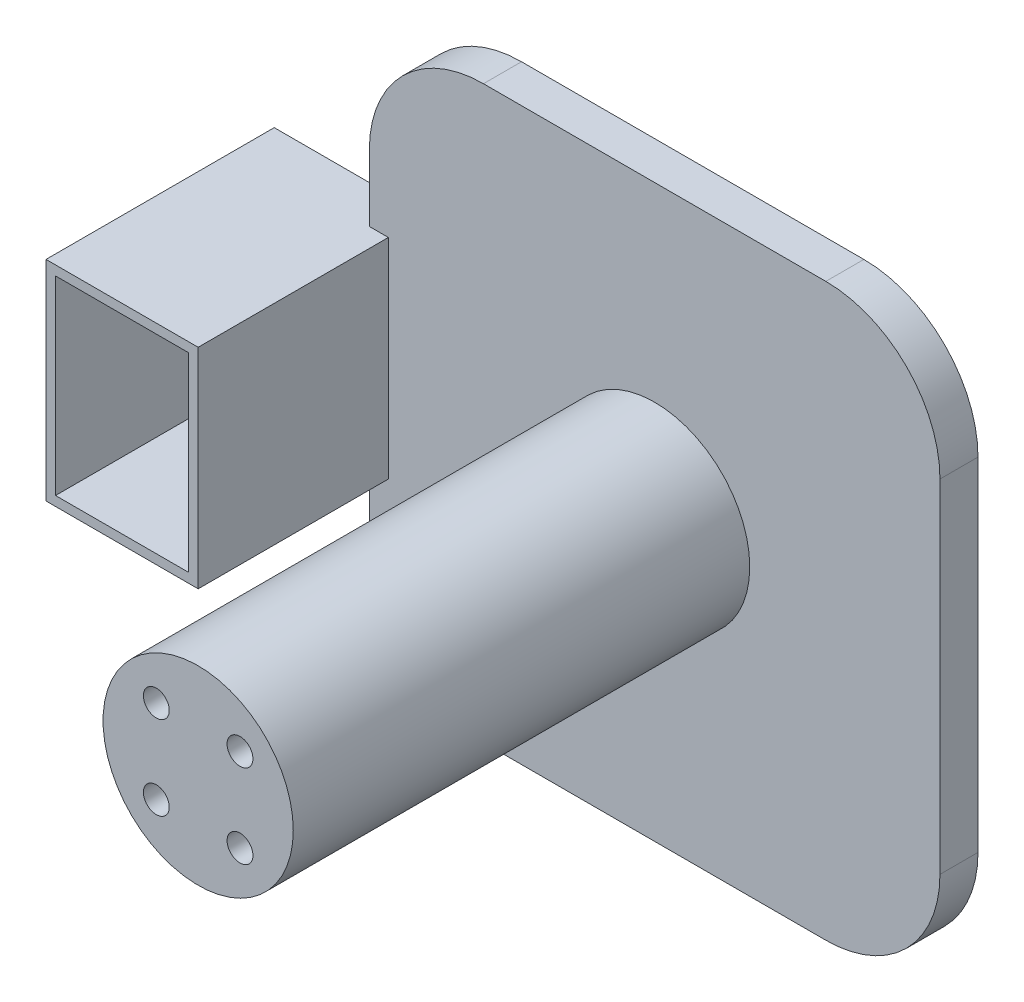
ISO-10303-21;
HEADER;
FILE_DESCRIPTION(('STEP AP214'),'2;1');
FILE_NAME('part.step','',(''),(''),'','','');
FILE_SCHEMA(('AUTOMOTIVE_DESIGN { 1 0 10303 214 1 1 1 1 }'));
ENDSEC;
DATA;
#1=APPLICATION_CONTEXT('core data for automotive mechanical design processes');
#2=APPLICATION_PROTOCOL_DEFINITION('international standard','automotive_design',2000,#1);
#3=PRODUCT_CONTEXT('',#1,'mechanical');
#4=PRODUCT('Part','Part','',(#3));
#5=PRODUCT_RELATED_PRODUCT_CATEGORY('part','',(#4));
#6=PRODUCT_DEFINITION_FORMATION('','',#4);
#7=PRODUCT_DEFINITION_CONTEXT('part definition',#1,'design');
#8=PRODUCT_DEFINITION('design','',#6,#7);
#9=PRODUCT_DEFINITION_SHAPE('','',#8);
#10=(LENGTH_UNIT() NAMED_UNIT(*) SI_UNIT(.MILLI.,.METRE.));
#11=(NAMED_UNIT(*) PLANE_ANGLE_UNIT() SI_UNIT($,.RADIAN.));
#12=(NAMED_UNIT(*) SI_UNIT($,.STERADIAN.) SOLID_ANGLE_UNIT());
#13=UNCERTAINTY_MEASURE_WITH_UNIT(LENGTH_MEASURE(1.E-05),#10,'distance_accuracy_value','');
#14=(GEOMETRIC_REPRESENTATION_CONTEXT(3) GLOBAL_UNCERTAINTY_ASSIGNED_CONTEXT((#13)) GLOBAL_UNIT_ASSIGNED_CONTEXT((#10,
#11,#12)) REPRESENTATION_CONTEXT('',''));
#15=CARTESIAN_POINT('',(0.,0.,0.));
#16=DIRECTION('',(0.,0.,1.));
#17=DIRECTION('',(1.,0.,0.));
#18=AXIS2_PLACEMENT_3D('',#15,#16,#17);
#19=CARTESIAN_POINT('',(120.,120.,10.));
#20=DIRECTION('',(0.,0.,1.));
#21=DIRECTION('',(1.,0.,0.));
#22=AXIS2_PLACEMENT_3D('',#19,#20,#21);
#23=PLANE('',#22);
#24=CARTESIAN_POINT('',(75.,75.,10.));
#25=DIRECTION('',(0.,0.,1.));
#26=DIRECTION('',(1.,0.,0.));
#27=AXIS2_PLACEMENT_3D('',#24,#25,#26);
#28=CIRCLE('',#27,25.);
#29=CARTESIAN_POINT('',(100.,75.,10.));
#30=VERTEX_POINT('',#29);
#31=EDGE_CURVE('E11',#30,#30,#28,.T.);
#32=ORIENTED_EDGE('',*,*,#31,.F.);
#33=EDGE_LOOP('',(#32));
#34=FACE_BOUND('',#33,.T.);
#35=DIRECTION('',(0.,1.,0.));
#36=VECTOR('',#35,1.);
#37=CARTESIAN_POINT('',(5.,102.5,10.));
#38=LINE('',#37,#36);
#39=CARTESIAN_POINT('',(5.00000000000001,47.5,10.));
#40=VERTEX_POINT('',#39);
#41=CARTESIAN_POINT('',(5.,102.5,10.));
#42=VERTEX_POINT('',#41);
#43=EDGE_CURVE('E62',#40,#42,#38,.T.);
#44=ORIENTED_EDGE('',*,*,#43,.F.);
#45=DIRECTION('',(1.,0.,0.));
#46=VECTOR('',#45,1.);
#47=CARTESIAN_POINT('',(5.00000000000001,47.5,10.));
#48=LINE('',#47,#46);
#49=CARTESIAN_POINT('',(0.,47.5,10.));
#50=VERTEX_POINT('',#49);
#51=EDGE_CURVE('E194',#50,#40,#48,.T.);
#52=ORIENTED_EDGE('',*,*,#51,.F.);
#53=DIRECTION('',(0.,-1.,0.));
#54=VECTOR('',#53,1.);
#55=CARTESIAN_POINT('',(0.,30.0000000000002,10.));
#56=LINE('',#55,#54);
#57=CARTESIAN_POINT('',(0.,30.0000000000002,10.));
#58=VERTEX_POINT('',#57);
#59=EDGE_CURVE('E327',#50,#58,#56,.T.);
#60=ORIENTED_EDGE('',*,*,#59,.T.);
#61=CARTESIAN_POINT('',(30.,30.,10.));
#62=DIRECTION('',(0.,0.,1.));
#63=DIRECTION('',(1.,0.,0.));
#64=AXIS2_PLACEMENT_3D('',#61,#62,#63);
#65=CIRCLE('',#64,30.);
#66=CARTESIAN_POINT('',(30.0000000000002,0.,10.));
#67=VERTEX_POINT('',#66);
#68=EDGE_CURVE('E331',#58,#67,#65,.T.);
#69=ORIENTED_EDGE('',*,*,#68,.T.);
#70=DIRECTION('',(1.,0.,0.));
#71=VECTOR('',#70,1.);
#72=CARTESIAN_POINT('',(30.0000000000002,0.,10.));
#73=LINE('',#72,#71);
#74=CARTESIAN_POINT('',(120.,0.,10.));
#75=VERTEX_POINT('',#74);
#76=EDGE_CURVE('E334',#67,#75,#73,.T.);
#77=ORIENTED_EDGE('',*,*,#76,.T.);
#78=CARTESIAN_POINT('',(120.,30.,10.));
#79=DIRECTION('',(0.,0.,1.));
#80=DIRECTION('',(1.,0.,0.));
#81=AXIS2_PLACEMENT_3D('',#78,#79,#80);
#82=CIRCLE('',#81,30.);
#83=CARTESIAN_POINT('',(150.,30.,10.));
#84=VERTEX_POINT('',#83);
#85=EDGE_CURVE('E337',#75,#84,#82,.T.);
#86=ORIENTED_EDGE('',*,*,#85,.T.);
#87=DIRECTION('',(0.,1.,0.));
#88=VECTOR('',#87,1.);
#89=CARTESIAN_POINT('',(150.,30.,10.));
#90=LINE('',#89,#88);
#91=CARTESIAN_POINT('',(150.,120.,10.));
#92=VERTEX_POINT('',#91);
#93=EDGE_CURVE('E340',#84,#92,#90,.T.);
#94=ORIENTED_EDGE('',*,*,#93,.T.);
#95=CARTESIAN_POINT('',(120.,120.,10.));
#96=DIRECTION('',(0.,0.,1.));
#97=DIRECTION('',(1.,0.,0.));
#98=AXIS2_PLACEMENT_3D('',#95,#96,#97);
#99=CIRCLE('',#98,30.);
#100=CARTESIAN_POINT('',(120.,150.,10.));
#101=VERTEX_POINT('',#100);
#102=EDGE_CURVE('E316',#92,#101,#99,.T.);
#103=ORIENTED_EDGE('',*,*,#102,.T.);
#104=DIRECTION('',(-1.,0.,0.));
#105=VECTOR('',#104,1.);
#106=CARTESIAN_POINT('',(30.,150.,10.));
#107=LINE('',#106,#105);
#108=CARTESIAN_POINT('',(30.,150.,10.));
#109=VERTEX_POINT('',#108);
#110=EDGE_CURVE('E320',#101,#109,#107,.T.);
#111=ORIENTED_EDGE('',*,*,#110,.T.);
#112=CARTESIAN_POINT('',(30.,120.,10.));
#113=DIRECTION('',(0.,0.,1.));
#114=DIRECTION('',(-1.,0.,0.));
#115=AXIS2_PLACEMENT_3D('',#112,#113,#114);
#116=CIRCLE('',#115,30.);
#117=CARTESIAN_POINT('',(0.,120.,10.));
#118=VERTEX_POINT('',#117);
#119=EDGE_CURVE('E324',#109,#118,#116,.T.);
#120=ORIENTED_EDGE('',*,*,#119,.T.);
#121=CARTESIAN_POINT('',(0.,102.5,10.));
#122=VERTEX_POINT('',#121);
#123=EDGE_CURVE('E328',#118,#122,#56,.T.);
#124=ORIENTED_EDGE('',*,*,#123,.T.);
#125=DIRECTION('',(-1.,0.,0.));
#126=VECTOR('',#125,1.);
#127=CARTESIAN_POINT('',(-35.,102.5,10.));
#128=LINE('',#127,#126);
#129=EDGE_CURVE('E67',#42,#122,#128,.T.);
#130=ORIENTED_EDGE('',*,*,#129,.F.);
#131=EDGE_LOOP('',(#44,#52,#60,#69,#77,#86,#94,#103,#111,#120,#124,#130));
#132=FACE_BOUND('',#131,.T.);
#133=ADVANCED_FACE('F45',(#34,#132),#23,.T.);
#134=CARTESIAN_POINT('',(0.,30.0000000000002,10.));
#135=DIRECTION('',(1.,0.,0.));
#136=DIRECTION('',(0.,0.,-1.));
#137=AXIS2_PLACEMENT_3D('',#134,#135,#136);
#138=PLANE('',#137);
#139=DIRECTION('',(0.,0.,1.));
#140=VECTOR('',#139,1.);
#141=CARTESIAN_POINT('',(0.,102.5,0.));
#142=LINE('',#141,#140);
#143=CARTESIAN_POINT('',(0.,102.5,0.));
#144=VERTEX_POINT('',#143);
#145=EDGE_CURVE('E272',#144,#122,#142,.T.);
#146=ORIENTED_EDGE('',*,*,#145,.T.);
#147=ORIENTED_EDGE('',*,*,#123,.F.);
#148=DIRECTION('',(0.,0.,-1.));
#149=VECTOR('',#148,1.);
#150=CARTESIAN_POINT('',(0.,120.,10.));
#151=LINE('',#150,#149);
#152=CARTESIAN_POINT('',(0.,120.,0.));
#153=VERTEX_POINT('',#152);
#154=EDGE_CURVE('E387',#118,#153,#151,.T.);
#155=ORIENTED_EDGE('',*,*,#154,.T.);
#156=DIRECTION('',(0.,-1.,0.));
#157=VECTOR('',#156,1.);
#158=CARTESIAN_POINT('',(0.,30.0000000000002,0.));
#159=LINE('',#158,#157);
#160=EDGE_CURVE('E354',#153,#144,#159,.T.);
#161=ORIENTED_EDGE('',*,*,#160,.T.);
#162=EDGE_LOOP('',(#146,#147,#155,#161));
#163=FACE_BOUND('',#162,.T.);
#164=ADVANCED_FACE('F415',(#163),#138,.F.);
#165=CARTESIAN_POINT('',(120.,120.,10.));
#166=DIRECTION('',(0.,0.,-1.));
#167=DIRECTION('',(-1.,0.,0.));
#168=AXIS2_PLACEMENT_3D('',#165,#166,#167);
#169=CYLINDRICAL_SURFACE('',#168,30.);
#170=CARTESIAN_POINT('',(120.,120.,0.));
#171=DIRECTION('',(0.,0.,1.));
#172=DIRECTION('',(1.,0.,0.));
#173=AXIS2_PLACEMENT_3D('',#170,#171,#172);
#174=CIRCLE('',#173,30.);
#175=CARTESIAN_POINT('',(150.,120.,0.));
#176=VERTEX_POINT('',#175);
#177=CARTESIAN_POINT('',(120.,150.,0.));
#178=VERTEX_POINT('',#177);
#179=EDGE_CURVE('E314',#176,#178,#174,.T.);
#180=ORIENTED_EDGE('',*,*,#179,.T.);
#181=DIRECTION('',(0.,0.,-1.));
#182=VECTOR('',#181,1.);
#183=CARTESIAN_POINT('',(120.,150.,10.));
#184=LINE('',#183,#182);
#185=EDGE_CURVE('E49',#101,#178,#184,.T.);
#186=ORIENTED_EDGE('',*,*,#185,.F.);
#187=ORIENTED_EDGE('',*,*,#102,.F.);
#188=DIRECTION('',(0.,0.,-1.));
#189=VECTOR('',#188,1.);
#190=CARTESIAN_POINT('',(150.,120.,10.));
#191=LINE('',#190,#189);
#192=EDGE_CURVE('E343',#92,#176,#191,.T.);
#193=ORIENTED_EDGE('',*,*,#192,.T.);
#194=EDGE_LOOP('',(#180,#186,#187,#193));
#195=FACE_BOUND('',#194,.T.);
#196=ADVANCED_FACE('F47',(#195),#169,.T.);
#197=CARTESIAN_POINT('',(30.,150.,10.));
#198=DIRECTION('',(0.,-1.,0.));
#199=DIRECTION('',(0.,0.,-1.));
#200=AXIS2_PLACEMENT_3D('',#197,#198,#199);
#201=PLANE('',#200);
#202=DIRECTION('',(-1.,0.,0.));
#203=VECTOR('',#202,1.);
#204=CARTESIAN_POINT('',(30.,150.,0.));
#205=LINE('',#204,#203);
#206=CARTESIAN_POINT('',(30.,150.,0.));
#207=VERTEX_POINT('',#206);
#208=EDGE_CURVE('E347',#178,#207,#205,.T.);
#209=ORIENTED_EDGE('',*,*,#208,.T.);
#210=DIRECTION('',(0.,0.,-1.));
#211=VECTOR('',#210,1.);
#212=CARTESIAN_POINT('',(30.,150.,10.));
#213=LINE('',#212,#211);
#214=EDGE_CURVE('E390',#109,#207,#213,.T.);
#215=ORIENTED_EDGE('',*,*,#214,.F.);
#216=ORIENTED_EDGE('',*,*,#110,.F.);
#217=ORIENTED_EDGE('',*,*,#185,.T.);
#218=EDGE_LOOP('',(#209,#215,#216,#217));
#219=FACE_BOUND('',#218,.T.);
#220=ADVANCED_FACE('F401',(#219),#201,.F.);
#221=CARTESIAN_POINT('',(30.,120.,10.));
#222=DIRECTION('',(0.,0.,-1.));
#223=DIRECTION('',(-1.,0.,0.));
#224=AXIS2_PLACEMENT_3D('',#221,#222,#223);
#225=CYLINDRICAL_SURFACE('',#224,30.);
#226=CARTESIAN_POINT('',(30.,120.,0.));
#227=DIRECTION('',(0.,0.,1.));
#228=DIRECTION('',(-1.,0.,0.));
#229=AXIS2_PLACEMENT_3D('',#226,#227,#228);
#230=CIRCLE('',#229,30.);
#231=EDGE_CURVE('E350',#207,#153,#230,.T.);
#232=ORIENTED_EDGE('',*,*,#231,.T.);
#233=ORIENTED_EDGE('',*,*,#154,.F.);
#234=ORIENTED_EDGE('',*,*,#119,.F.);
#235=ORIENTED_EDGE('',*,*,#214,.T.);
#236=EDGE_LOOP('',(#232,#233,#234,#235));
#237=FACE_BOUND('',#236,.T.);
#238=ADVANCED_FACE('F412',(#237),#225,.T.);
#239=ORIENTED_EDGE('',*,*,#59,.F.);
#240=DIRECTION('',(0.,0.,1.));
#241=VECTOR('',#240,1.);
#242=CARTESIAN_POINT('',(0.,47.5,0.));
#243=LINE('',#242,#241);
#244=CARTESIAN_POINT('',(0.,47.5,0.));
#245=VERTEX_POINT('',#244);
#246=EDGE_CURVE('E275',#245,#50,#243,.T.);
#247=ORIENTED_EDGE('',*,*,#246,.F.);
#248=CARTESIAN_POINT('',(0.,30.0000000000002,0.));
#249=VERTEX_POINT('',#248);
#250=EDGE_CURVE('E353',#245,#249,#159,.T.);
#251=ORIENTED_EDGE('',*,*,#250,.T.);
#252=DIRECTION('',(0.,0.,-1.));
#253=VECTOR('',#252,1.);
#254=CARTESIAN_POINT('',(0.,30.0000000000002,10.));
#255=LINE('',#254,#253);
#256=EDGE_CURVE('E383',#58,#249,#255,.T.);
#257=ORIENTED_EDGE('',*,*,#256,.F.);
#258=EDGE_LOOP('',(#239,#247,#251,#257));
#259=FACE_BOUND('',#258,.T.);
#260=ADVANCED_FACE('F436',(#259),#138,.F.);
#261=CARTESIAN_POINT('',(30.,30.,10.));
#262=DIRECTION('',(0.,0.,-1.));
#263=DIRECTION('',(-1.,0.,0.));
#264=AXIS2_PLACEMENT_3D('',#261,#262,#263);
#265=CYLINDRICAL_SURFACE('',#264,30.);
#266=CARTESIAN_POINT('',(30.,30.,0.));
#267=DIRECTION('',(0.,0.,1.));
#268=DIRECTION('',(1.,0.,0.));
#269=AXIS2_PLACEMENT_3D('',#266,#267,#268);
#270=CIRCLE('',#269,30.);
#271=CARTESIAN_POINT('',(30.0000000000002,0.,0.));
#272=VERTEX_POINT('',#271);
#273=EDGE_CURVE('E357',#249,#272,#270,.T.);
#274=ORIENTED_EDGE('',*,*,#273,.T.);
#275=DIRECTION('',(0.,0.,-1.));
#276=VECTOR('',#275,1.);
#277=CARTESIAN_POINT('',(30.0000000000002,0.,10.));
#278=LINE('',#277,#276);
#279=EDGE_CURVE('E379',#67,#272,#278,.T.);
#280=ORIENTED_EDGE('',*,*,#279,.F.);
#281=ORIENTED_EDGE('',*,*,#68,.F.);
#282=ORIENTED_EDGE('',*,*,#256,.T.);
#283=EDGE_LOOP('',(#274,#280,#281,#282));
#284=FACE_BOUND('',#283,.T.);
#285=ADVANCED_FACE('F439',(#284),#265,.T.);
#286=CARTESIAN_POINT('',(30.0000000000002,0.,10.));
#287=DIRECTION('',(0.,1.,0.));
#288=DIRECTION('',(0.,0.,1.));
#289=AXIS2_PLACEMENT_3D('',#286,#287,#288);
#290=PLANE('',#289);
#291=DIRECTION('',(1.,0.,0.));
#292=VECTOR('',#291,1.);
#293=CARTESIAN_POINT('',(30.0000000000002,0.,0.));
#294=LINE('',#293,#292);
#295=CARTESIAN_POINT('',(120.,0.,0.));
#296=VERTEX_POINT('',#295);
#297=EDGE_CURVE('E360',#272,#296,#294,.T.);
#298=ORIENTED_EDGE('',*,*,#297,.T.);
#299=DIRECTION('',(0.,0.,-1.));
#300=VECTOR('',#299,1.);
#301=CARTESIAN_POINT('',(120.,0.,10.));
#302=LINE('',#301,#300);
#303=EDGE_CURVE('E375',#75,#296,#302,.T.);
#304=ORIENTED_EDGE('',*,*,#303,.F.);
#305=ORIENTED_EDGE('',*,*,#76,.F.);
#306=ORIENTED_EDGE('',*,*,#279,.T.);
#307=EDGE_LOOP('',(#298,#304,#305,#306));
#308=FACE_BOUND('',#307,.T.);
#309=ADVANCED_FACE('F444',(#308),#290,.F.);
#310=CARTESIAN_POINT('',(120.,30.,10.));
#311=DIRECTION('',(0.,0.,-1.));
#312=DIRECTION('',(-1.,0.,0.));
#313=AXIS2_PLACEMENT_3D('',#310,#311,#312);
#314=CYLINDRICAL_SURFACE('',#313,30.);
#315=CARTESIAN_POINT('',(120.,30.,0.));
#316=DIRECTION('',(0.,0.,1.));
#317=DIRECTION('',(1.,0.,0.));
#318=AXIS2_PLACEMENT_3D('',#315,#316,#317);
#319=CIRCLE('',#318,30.);
#320=CARTESIAN_POINT('',(150.,30.,0.));
#321=VERTEX_POINT('',#320);
#322=EDGE_CURVE('E363',#296,#321,#319,.T.);
#323=ORIENTED_EDGE('',*,*,#322,.T.);
#324=DIRECTION('',(0.,0.,-1.));
#325=VECTOR('',#324,1.);
#326=CARTESIAN_POINT('',(150.,30.,10.));
#327=LINE('',#326,#325);
#328=EDGE_CURVE('E371',#84,#321,#327,.T.);
#329=ORIENTED_EDGE('',*,*,#328,.F.);
#330=ORIENTED_EDGE('',*,*,#85,.F.);
#331=ORIENTED_EDGE('',*,*,#303,.T.);
#332=EDGE_LOOP('',(#323,#329,#330,#331));
#333=FACE_BOUND('',#332,.T.);
#334=ADVANCED_FACE('F449',(#333),#314,.T.);
#335=CARTESIAN_POINT('',(150.,30.,10.));
#336=DIRECTION('',(-1.,0.,0.));
#337=DIRECTION('',(0.,0.,1.));
#338=AXIS2_PLACEMENT_3D('',#335,#336,#337);
#339=PLANE('',#338);
#340=DIRECTION('',(0.,1.,0.));
#341=VECTOR('',#340,1.);
#342=CARTESIAN_POINT('',(150.,30.,0.));
#343=LINE('',#342,#341);
#344=EDGE_CURVE('E321',#321,#176,#343,.T.);
#345=ORIENTED_EDGE('',*,*,#344,.T.);
#346=ORIENTED_EDGE('',*,*,#192,.F.);
#347=ORIENTED_EDGE('',*,*,#93,.F.);
#348=ORIENTED_EDGE('',*,*,#328,.T.);
#349=EDGE_LOOP('',(#345,#346,#347,#348));
#350=FACE_BOUND('',#349,.T.);
#351=ADVANCED_FACE('F451',(#350),#339,.F.);
#352=CARTESIAN_POINT('',(120.,120.,0.));
#353=DIRECTION('',(0.,0.,1.));
#354=DIRECTION('',(1.,0.,0.));
#355=AXIS2_PLACEMENT_3D('',#352,#353,#354);
#356=PLANE('',#355);
#357=ORIENTED_EDGE('',*,*,#179,.F.);
#358=ORIENTED_EDGE('',*,*,#344,.F.);
#359=ORIENTED_EDGE('',*,*,#322,.F.);
#360=ORIENTED_EDGE('',*,*,#297,.F.);
#361=ORIENTED_EDGE('',*,*,#273,.F.);
#362=ORIENTED_EDGE('',*,*,#250,.F.);
#363=DIRECTION('',(1.,0.,0.));
#364=VECTOR('',#363,1.);
#365=CARTESIAN_POINT('',(0.,47.5,0.));
#366=LINE('',#365,#364);
#367=CARTESIAN_POINT('',(-35.,47.5,0.));
#368=VERTEX_POINT('',#367);
#369=EDGE_CURVE('E259',#368,#245,#366,.T.);
#370=ORIENTED_EDGE('',*,*,#369,.F.);
#371=DIRECTION('',(0.,-1.,0.));
#372=VECTOR('',#371,1.);
#373=CARTESIAN_POINT('',(-35.,0.,0.));
#374=LINE('',#373,#372);
#375=CARTESIAN_POINT('',(-35.,102.5,0.));
#376=VERTEX_POINT('',#375);
#377=EDGE_CURVE('E255',#376,#368,#374,.T.);
#378=ORIENTED_EDGE('',*,*,#377,.F.);
#379=DIRECTION('',(1.,0.,0.));
#380=VECTOR('',#379,1.);
#381=CARTESIAN_POINT('',(0.,102.5,0.));
#382=LINE('',#381,#380);
#383=EDGE_CURVE('E263',#376,#144,#382,.T.);
#384=ORIENTED_EDGE('',*,*,#383,.T.);
#385=ORIENTED_EDGE('',*,*,#160,.F.);
#386=ORIENTED_EDGE('',*,*,#231,.F.);
#387=ORIENTED_EDGE('',*,*,#208,.F.);
#388=EDGE_LOOP('',(#357,#358,#359,#360,#361,#362,#370,#378,#384,#385,#386,#387));
#389=FACE_BOUND('',#388,.T.);
#390=ADVANCED_FACE('F408',(#389),#356,.F.);
#391=CARTESIAN_POINT('',(75.,75.,130.));
#392=DIRECTION('',(0.,0.,-1.));
#393=DIRECTION('',(-1.,0.,0.));
#394=AXIS2_PLACEMENT_3D('',#391,#392,#393);
#395=CYLINDRICAL_SURFACE('',#394,25.);
#396=CARTESIAN_POINT('',(75.,75.,130.));
#397=DIRECTION('',(0.,0.,1.));
#398=DIRECTION('',(1.,0.,0.));
#399=AXIS2_PLACEMENT_3D('',#396,#397,#398);
#400=CIRCLE('',#399,25.);
#401=CARTESIAN_POINT('',(100.,75.,130.));
#402=VERTEX_POINT('',#401);
#403=EDGE_CURVE('E308',#402,#402,#400,.T.);
#404=ORIENTED_EDGE('',*,*,#403,.F.);
#405=EDGE_LOOP('',(#404));
#406=FACE_BOUND('',#405,.T.);
#407=ORIENTED_EDGE('',*,*,#31,.T.);
#408=EDGE_LOOP('',(#407));
#409=FACE_BOUND('',#408,.T.);
#410=ADVANCED_FACE('F458',(#406,#409),#395,.T.);
#411=CARTESIAN_POINT('',(0.,0.,130.));
#412=DIRECTION('',(0.,0.,1.));
#413=DIRECTION('',(1.,0.,0.));
#414=AXIS2_PLACEMENT_3D('',#411,#412,#413);
#415=PLANE('',#414);
#416=CARTESIAN_POINT('',(86.,86.,130.));
#417=DIRECTION('',(0.,0.,1.));
#418=DIRECTION('',(1.,0.,0.));
#419=AXIS2_PLACEMENT_3D('',#416,#417,#418);
#420=CIRCLE('',#419,3.4);
#421=CARTESIAN_POINT('',(89.4,86.,130.));
#422=VERTEX_POINT('',#421);
#423=EDGE_CURVE('E271',#422,#422,#420,.T.);
#424=ORIENTED_EDGE('',*,*,#423,.F.);
#425=EDGE_LOOP('',(#424));
#426=FACE_BOUND('',#425,.T.);
#427=CARTESIAN_POINT('',(86.,64.,130.));
#428=DIRECTION('',(0.,0.,1.));
#429=DIRECTION('',(1.,0.,0.));
#430=AXIS2_PLACEMENT_3D('',#427,#428,#429);
#431=CIRCLE('',#430,3.4);
#432=CARTESIAN_POINT('',(89.4,64.,130.));
#433=VERTEX_POINT('',#432);
#434=EDGE_CURVE('E293',#433,#433,#431,.T.);
#435=ORIENTED_EDGE('',*,*,#434,.F.);
#436=EDGE_LOOP('',(#435));
#437=FACE_BOUND('',#436,.T.);
#438=CARTESIAN_POINT('',(64.,64.,130.));
#439=DIRECTION('',(0.,0.,1.));
#440=DIRECTION('',(1.,0.,0.));
#441=AXIS2_PLACEMENT_3D('',#438,#439,#440);
#442=CIRCLE('',#441,3.4);
#443=CARTESIAN_POINT('',(67.4,64.,130.));
#444=VERTEX_POINT('',#443);
#445=EDGE_CURVE('E285',#444,#444,#442,.T.);
#446=ORIENTED_EDGE('',*,*,#445,.F.);
#447=EDGE_LOOP('',(#446));
#448=FACE_BOUND('',#447,.T.);
#449=CARTESIAN_POINT('',(64.,86.,130.));
#450=DIRECTION('',(0.,0.,1.));
#451=DIRECTION('',(1.,0.,0.));
#452=AXIS2_PLACEMENT_3D('',#449,#450,#451);
#453=CIRCLE('',#452,3.4);
#454=CARTESIAN_POINT('',(67.4,86.,130.));
#455=VERTEX_POINT('',#454);
#456=EDGE_CURVE('E284',#455,#455,#453,.T.);
#457=ORIENTED_EDGE('',*,*,#456,.F.);
#458=EDGE_LOOP('',(#457));
#459=FACE_BOUND('',#458,.T.);
#460=ORIENTED_EDGE('',*,*,#403,.T.);
#461=EDGE_LOOP('',(#460));
#462=FACE_BOUND('',#461,.T.);
#463=ADVANCED_FACE('F536',(#426,#437,#448,#459,#462),#415,.T.);
#464=CARTESIAN_POINT('',(64.,86.,120.));
#465=DIRECTION('',(0.,0.,1.));
#466=DIRECTION('',(1.,0.,0.));
#467=AXIS2_PLACEMENT_3D('',#464,#465,#466);
#468=CYLINDRICAL_SURFACE('',#467,3.4);
#469=CARTESIAN_POINT('',(64.,86.,120.));
#470=DIRECTION('',(0.,0.,1.));
#471=DIRECTION('',(1.,0.,0.));
#472=AXIS2_PLACEMENT_3D('',#469,#470,#471);
#473=CIRCLE('',#472,3.4);
#474=CARTESIAN_POINT('',(67.4,86.,120.));
#475=VERTEX_POINT('',#474);
#476=EDGE_CURVE('E304',#475,#475,#473,.T.);
#477=ORIENTED_EDGE('',*,*,#476,.F.);
#478=EDGE_LOOP('',(#477));
#479=FACE_BOUND('',#478,.T.);
#480=ORIENTED_EDGE('',*,*,#456,.T.);
#481=EDGE_LOOP('',(#480));
#482=FACE_BOUND('',#481,.T.);
#483=ADVANCED_FACE('F532',(#479,#482),#468,.F.);
#484=CARTESIAN_POINT('',(0.,0.,120.));
#485=DIRECTION('',(0.,0.,1.));
#486=DIRECTION('',(1.,0.,0.));
#487=AXIS2_PLACEMENT_3D('',#484,#485,#486);
#488=PLANE('',#487);
#489=ORIENTED_EDGE('',*,*,#476,.T.);
#490=EDGE_LOOP('',(#489));
#491=FACE_BOUND('',#490,.T.);
#492=ADVANCED_FACE('F514',(#491),#488,.T.);
#493=CARTESIAN_POINT('',(64.,64.,120.));
#494=DIRECTION('',(0.,0.,1.));
#495=DIRECTION('',(1.,0.,0.));
#496=AXIS2_PLACEMENT_3D('',#493,#494,#495);
#497=CYLINDRICAL_SURFACE('',#496,3.4);
#498=CARTESIAN_POINT('',(64.,64.,120.));
#499=DIRECTION('',(0.,0.,1.));
#500=DIRECTION('',(1.,0.,0.));
#501=AXIS2_PLACEMENT_3D('',#498,#499,#500);
#502=CIRCLE('',#501,3.4);
#503=CARTESIAN_POINT('',(67.4,64.,120.));
#504=VERTEX_POINT('',#503);
#505=EDGE_CURVE('E280',#504,#504,#502,.T.);
#506=ORIENTED_EDGE('',*,*,#505,.F.);
#507=EDGE_LOOP('',(#506));
#508=FACE_BOUND('',#507,.T.);
#509=ORIENTED_EDGE('',*,*,#445,.T.);
#510=EDGE_LOOP('',(#509));
#511=FACE_BOUND('',#510,.T.);
#512=ADVANCED_FACE('F510',(#508,#511),#497,.F.);
#513=CARTESIAN_POINT('',(0.,0.,120.));
#514=DIRECTION('',(0.,0.,1.));
#515=DIRECTION('',(1.,0.,0.));
#516=AXIS2_PLACEMENT_3D('',#513,#514,#515);
#517=PLANE('',#516);
#518=ORIENTED_EDGE('',*,*,#505,.T.);
#519=EDGE_LOOP('',(#518));
#520=FACE_BOUND('',#519,.T.);
#521=ADVANCED_FACE('F506',(#520),#517,.T.);
#522=CARTESIAN_POINT('',(86.,64.,120.));
#523=DIRECTION('',(0.,0.,1.));
#524=DIRECTION('',(1.,0.,0.));
#525=AXIS2_PLACEMENT_3D('',#522,#523,#524);
#526=CYLINDRICAL_SURFACE('',#525,3.4);
#527=CARTESIAN_POINT('',(86.,64.,120.));
#528=DIRECTION('',(0.,0.,1.));
#529=DIRECTION('',(1.,0.,0.));
#530=AXIS2_PLACEMENT_3D('',#527,#528,#529);
#531=CIRCLE('',#530,3.4);
#532=CARTESIAN_POINT('',(89.4,64.,120.));
#533=VERTEX_POINT('',#532);
#534=EDGE_CURVE('E289',#533,#533,#531,.T.);
#535=ORIENTED_EDGE('',*,*,#534,.F.);
#536=EDGE_LOOP('',(#535));
#537=FACE_BOUND('',#536,.T.);
#538=ORIENTED_EDGE('',*,*,#434,.T.);
#539=EDGE_LOOP('',(#538));
#540=FACE_BOUND('',#539,.T.);
#541=ADVANCED_FACE('F509',(#537,#540),#526,.F.);
#542=CARTESIAN_POINT('',(0.,0.,120.));
#543=DIRECTION('',(0.,0.,1.));
#544=DIRECTION('',(1.,0.,0.));
#545=AXIS2_PLACEMENT_3D('',#542,#543,#544);
#546=PLANE('',#545);
#547=ORIENTED_EDGE('',*,*,#534,.T.);
#548=EDGE_LOOP('',(#547));
#549=FACE_BOUND('',#548,.T.);
#550=ADVANCED_FACE('F516',(#549),#546,.T.);
#551=CARTESIAN_POINT('',(86.,86.,120.));
#552=DIRECTION('',(0.,0.,1.));
#553=DIRECTION('',(1.,0.,0.));
#554=AXIS2_PLACEMENT_3D('',#551,#552,#553);
#555=CYLINDRICAL_SURFACE('',#554,3.4);
#556=CARTESIAN_POINT('',(86.,86.,120.));
#557=DIRECTION('',(0.,0.,1.));
#558=DIRECTION('',(1.,0.,0.));
#559=AXIS2_PLACEMENT_3D('',#556,#557,#558);
#560=CIRCLE('',#559,3.4);
#561=CARTESIAN_POINT('',(89.4,86.,120.));
#562=VERTEX_POINT('',#561);
#563=EDGE_CURVE('E297',#562,#562,#560,.T.);
#564=ORIENTED_EDGE('',*,*,#563,.F.);
#565=EDGE_LOOP('',(#564));
#566=FACE_BOUND('',#565,.T.);
#567=ORIENTED_EDGE('',*,*,#423,.T.);
#568=EDGE_LOOP('',(#567));
#569=FACE_BOUND('',#568,.T.);
#570=ADVANCED_FACE('F519',(#566,#569),#555,.F.);
#571=CARTESIAN_POINT('',(0.,0.,120.));
#572=DIRECTION('',(0.,0.,1.));
#573=DIRECTION('',(1.,0.,0.));
#574=AXIS2_PLACEMENT_3D('',#571,#572,#573);
#575=PLANE('',#574);
#576=ORIENTED_EDGE('',*,*,#563,.T.);
#577=EDGE_LOOP('',(#576));
#578=FACE_BOUND('',#577,.T.);
#579=ADVANCED_FACE('F504',(#578),#575,.T.);
#580=CARTESIAN_POINT('',(-35.,0.,0.));
#581=DIRECTION('',(-1.,0.,0.));
#582=DIRECTION('',(0.,0.,1.));
#583=AXIS2_PLACEMENT_3D('',#580,#581,#582);
#584=PLANE('',#583);
#585=DIRECTION('',(0.,0.,1.));
#586=VECTOR('',#585,1.);
#587=CARTESIAN_POINT('',(-35.,47.5,0.));
#588=LINE('',#587,#586);
#589=CARTESIAN_POINT('',(-35.,47.5,60.));
#590=VERTEX_POINT('',#589);
#591=EDGE_CURVE('E267',#368,#590,#588,.T.);
#592=ORIENTED_EDGE('',*,*,#591,.T.);
#593=DIRECTION('',(0.,-1.,0.));
#594=VECTOR('',#593,1.);
#595=CARTESIAN_POINT('',(-35.,102.5,60.));
#596=LINE('',#595,#594);
#597=CARTESIAN_POINT('',(-35.,102.5,60.));
#598=VERTEX_POINT('',#597);
#599=EDGE_CURVE('E227',#598,#590,#596,.T.);
#600=ORIENTED_EDGE('',*,*,#599,.F.);
#601=DIRECTION('',(0.,0.,1.));
#602=VECTOR('',#601,1.);
#603=CARTESIAN_POINT('',(-35.,102.5,0.));
#604=LINE('',#603,#602);
#605=EDGE_CURVE('E268',#376,#598,#604,.T.);
#606=ORIENTED_EDGE('',*,*,#605,.F.);
#607=ORIENTED_EDGE('',*,*,#377,.T.);
#608=EDGE_LOOP('',(#592,#600,#606,#607));
#609=FACE_BOUND('',#608,.T.);
#610=ADVANCED_FACE('F499',(#609),#584,.T.);
#611=CARTESIAN_POINT('',(0.,102.5,0.));
#612=DIRECTION('',(0.,-1.,0.));
#613=DIRECTION('',(0.,0.,-1.));
#614=AXIS2_PLACEMENT_3D('',#611,#612,#613);
#615=PLANE('',#614);
#616=ORIENTED_EDGE('',*,*,#605,.T.);
#617=DIRECTION('',(-1.,0.,0.));
#618=VECTOR('',#617,1.);
#619=CARTESIAN_POINT('',(0.,102.5,60.));
#620=LINE('',#619,#618);
#621=CARTESIAN_POINT('',(5.,102.5,60.));
#622=VERTEX_POINT('',#621);
#623=EDGE_CURVE('E237',#622,#598,#620,.T.);
#624=ORIENTED_EDGE('',*,*,#623,.F.);
#625=DIRECTION('',(0.,0.,-1.));
#626=VECTOR('',#625,1.);
#627=CARTESIAN_POINT('',(5.,102.5,60.));
#628=LINE('',#627,#626);
#629=EDGE_CURVE('E241',#622,#42,#628,.T.);
#630=ORIENTED_EDGE('',*,*,#629,.T.);
#631=ORIENTED_EDGE('',*,*,#129,.T.);
#632=ORIENTED_EDGE('',*,*,#145,.F.);
#633=ORIENTED_EDGE('',*,*,#383,.F.);
#634=EDGE_LOOP('',(#616,#624,#630,#631,#632,#633));
#635=FACE_BOUND('',#634,.T.);
#636=ADVANCED_FACE('F418',(#635),#615,.F.);
#637=CARTESIAN_POINT('',(0.,47.5,0.));
#638=DIRECTION('',(0.,-1.,0.));
#639=DIRECTION('',(0.,0.,-1.));
#640=AXIS2_PLACEMENT_3D('',#637,#638,#639);
#641=PLANE('',#640);
#642=ORIENTED_EDGE('',*,*,#246,.T.);
#643=ORIENTED_EDGE('',*,*,#51,.T.);
#644=DIRECTION('',(0.,0.,-1.));
#645=VECTOR('',#644,1.);
#646=CARTESIAN_POINT('',(5.00000000000001,47.5,60.));
#647=LINE('',#646,#645);
#648=CARTESIAN_POINT('',(5.00000000000001,47.5,60.));
#649=VERTEX_POINT('',#648);
#650=EDGE_CURVE('E251',#649,#40,#647,.T.);
#651=ORIENTED_EDGE('',*,*,#650,.F.);
#652=DIRECTION('',(1.,0.,0.));
#653=VECTOR('',#652,1.);
#654=CARTESIAN_POINT('',(-35.,47.5,60.));
#655=LINE('',#654,#653);
#656=EDGE_CURVE('E231',#590,#649,#655,.T.);
#657=ORIENTED_EDGE('',*,*,#656,.F.);
#658=ORIENTED_EDGE('',*,*,#591,.F.);
#659=ORIENTED_EDGE('',*,*,#369,.T.);
#660=EDGE_LOOP('',(#642,#643,#651,#657,#658,#659));
#661=FACE_BOUND('',#660,.T.);
#662=ADVANCED_FACE('F428',(#661),#641,.T.);
#663=CARTESIAN_POINT('',(0.,0.,60.));
#664=DIRECTION('',(0.,0.,1.));
#665=DIRECTION('',(1.,0.,0.));
#666=AXIS2_PLACEMENT_3D('',#663,#664,#665);
#667=PLANE('',#666);
#668=ORIENTED_EDGE('',*,*,#599,.T.);
#669=ORIENTED_EDGE('',*,*,#656,.T.);
#670=DIRECTION('',(0.,1.,0.));
#671=VECTOR('',#670,1.);
#672=CARTESIAN_POINT('',(5.,102.5,60.));
#673=LINE('',#672,#671);
#674=EDGE_CURVE('E234',#649,#622,#673,.T.);
#675=ORIENTED_EDGE('',*,*,#674,.T.);
#676=ORIENTED_EDGE('',*,*,#623,.T.);
#677=EDGE_LOOP('',(#668,#669,#675,#676));
#678=FACE_BOUND('',#677,.T.);
#679=DIRECTION('',(0.,-1.,0.));
#680=VECTOR('',#679,1.);
#681=CARTESIAN_POINT('',(-32.5,100.,60.));
#682=LINE('',#681,#680);
#683=CARTESIAN_POINT('',(-32.5,100.,60.));
#684=VERTEX_POINT('',#683);
#685=CARTESIAN_POINT('',(-32.5,50.,60.));
#686=VERTEX_POINT('',#685);
#687=EDGE_CURVE('E184',#684,#686,#682,.T.);
#688=ORIENTED_EDGE('',*,*,#687,.F.);
#689=DIRECTION('',(-1.,0.,0.));
#690=VECTOR('',#689,1.);
#691=CARTESIAN_POINT('',(2.5,100.,60.));
#692=LINE('',#691,#690);
#693=CARTESIAN_POINT('',(2.5,100.,60.));
#694=VERTEX_POINT('',#693);
#695=EDGE_CURVE('E173',#694,#684,#692,.T.);
#696=ORIENTED_EDGE('',*,*,#695,.F.);
#697=DIRECTION('',(0.,1.,0.));
#698=VECTOR('',#697,1.);
#699=CARTESIAN_POINT('',(2.5,100.,60.));
#700=LINE('',#699,#698);
#701=CARTESIAN_POINT('',(2.5,50.,60.));
#702=VERTEX_POINT('',#701);
#703=EDGE_CURVE('E204',#702,#694,#700,.T.);
#704=ORIENTED_EDGE('',*,*,#703,.F.);
#705=DIRECTION('',(1.,0.,0.));
#706=VECTOR('',#705,1.);
#707=CARTESIAN_POINT('',(-32.5,50.,60.));
#708=LINE('',#707,#706);
#709=EDGE_CURVE('E200',#686,#702,#708,.T.);
#710=ORIENTED_EDGE('',*,*,#709,.F.);
#711=EDGE_LOOP('',(#688,#696,#704,#710));
#712=FACE_BOUND('',#711,.T.);
#713=ADVANCED_FACE('F198',(#678,#712),#667,.T.);
#714=CARTESIAN_POINT('',(5.,102.5,60.));
#715=DIRECTION('',(-1.,0.,0.));
#716=DIRECTION('',(0.,-1.,0.));
#717=AXIS2_PLACEMENT_3D('',#714,#715,#716);
#718=PLANE('',#717);
#719=ORIENTED_EDGE('',*,*,#43,.T.);
#720=ORIENTED_EDGE('',*,*,#629,.F.);
#721=ORIENTED_EDGE('',*,*,#674,.F.);
#722=ORIENTED_EDGE('',*,*,#650,.T.);
#723=EDGE_LOOP('',(#719,#720,#721,#722));
#724=FACE_BOUND('',#723,.T.);
#725=ADVANCED_FACE('F424',(#724),#718,.F.);
#726=CARTESIAN_POINT('',(2.5,100.,60.));
#727=DIRECTION('',(0.,-1.,0.));
#728=DIRECTION('',(0.,0.,-1.));
#729=AXIS2_PLACEMENT_3D('',#726,#727,#728);
#730=PLANE('',#729);
#731=DIRECTION('',(-1.,0.,0.));
#732=VECTOR('',#731,1.);
#733=CARTESIAN_POINT('',(2.5,100.,10.));
#734=LINE('',#733,#732);
#735=CARTESIAN_POINT('',(2.5,100.,10.));
#736=VERTEX_POINT('',#735);
#737=CARTESIAN_POINT('',(-32.5,100.,10.));
#738=VERTEX_POINT('',#737);
#739=EDGE_CURVE('E209',#736,#738,#734,.T.);
#740=ORIENTED_EDGE('',*,*,#739,.F.);
#741=DIRECTION('',(0.,0.,-1.));
#742=VECTOR('',#741,1.);
#743=CARTESIAN_POINT('',(2.5,100.,60.));
#744=LINE('',#743,#742);
#745=EDGE_CURVE('E179',#694,#736,#744,.T.);
#746=ORIENTED_EDGE('',*,*,#745,.F.);
#747=ORIENTED_EDGE('',*,*,#695,.T.);
#748=DIRECTION('',(0.,0.,-1.));
#749=VECTOR('',#748,1.);
#750=CARTESIAN_POINT('',(-32.5,100.,60.));
#751=LINE('',#750,#749);
#752=EDGE_CURVE('E177',#684,#738,#751,.T.);
#753=ORIENTED_EDGE('',*,*,#752,.T.);
#754=EDGE_LOOP('',(#740,#746,#747,#753));
#755=FACE_BOUND('',#754,.T.);
#756=ADVANCED_FACE('F176',(#755),#730,.T.);
#757=CARTESIAN_POINT('',(-32.5,100.,60.));
#758=DIRECTION('',(1.,0.,0.));
#759=DIRECTION('',(0.,0.,-1.));
#760=AXIS2_PLACEMENT_3D('',#757,#758,#759);
#761=PLANE('',#760);
#762=DIRECTION('',(0.,-1.,0.));
#763=VECTOR('',#762,1.);
#764=CARTESIAN_POINT('',(-32.5,100.,10.));
#765=LINE('',#764,#763);
#766=CARTESIAN_POINT('',(-32.5,50.,10.));
#767=VERTEX_POINT('',#766);
#768=EDGE_CURVE('E192',#738,#767,#765,.T.);
#769=ORIENTED_EDGE('',*,*,#768,.F.);
#770=ORIENTED_EDGE('',*,*,#752,.F.);
#771=ORIENTED_EDGE('',*,*,#687,.T.);
#772=DIRECTION('',(0.,0.,-1.));
#773=VECTOR('',#772,1.);
#774=CARTESIAN_POINT('',(-32.5,50.,60.));
#775=LINE('',#774,#773);
#776=EDGE_CURVE('E195',#686,#767,#775,.T.);
#777=ORIENTED_EDGE('',*,*,#776,.T.);
#778=EDGE_LOOP('',(#769,#770,#771,#777));
#779=FACE_BOUND('',#778,.T.);
#780=ADVANCED_FACE('F189',(#779),#761,.T.);
#781=CARTESIAN_POINT('',(-32.5,50.,60.));
#782=DIRECTION('',(0.,1.,0.));
#783=DIRECTION('',(0.,0.,1.));
#784=AXIS2_PLACEMENT_3D('',#781,#782,#783);
#785=PLANE('',#784);
#786=DIRECTION('',(1.,0.,0.));
#787=VECTOR('',#786,1.);
#788=CARTESIAN_POINT('',(-32.5,50.,10.));
#789=LINE('',#788,#787);
#790=CARTESIAN_POINT('',(2.5,50.,10.));
#791=VERTEX_POINT('',#790);
#792=EDGE_CURVE('E214',#767,#791,#789,.T.);
#793=ORIENTED_EDGE('',*,*,#792,.F.);
#794=ORIENTED_EDGE('',*,*,#776,.F.);
#795=ORIENTED_EDGE('',*,*,#709,.T.);
#796=DIRECTION('',(0.,0.,-1.));
#797=VECTOR('',#796,1.);
#798=CARTESIAN_POINT('',(2.5,50.,60.));
#799=LINE('',#798,#797);
#800=EDGE_CURVE('E221',#702,#791,#799,.T.);
#801=ORIENTED_EDGE('',*,*,#800,.T.);
#802=EDGE_LOOP('',(#793,#794,#795,#801));
#803=FACE_BOUND('',#802,.T.);
#804=ADVANCED_FACE('F477',(#803),#785,.T.);
#805=CARTESIAN_POINT('',(2.5,100.,60.));
#806=DIRECTION('',(-1.,0.,0.));
#807=DIRECTION('',(0.,0.,1.));
#808=AXIS2_PLACEMENT_3D('',#805,#806,#807);
#809=PLANE('',#808);
#810=DIRECTION('',(0.,1.,0.));
#811=VECTOR('',#810,1.);
#812=CARTESIAN_POINT('',(2.5,100.,10.));
#813=LINE('',#812,#811);
#814=EDGE_CURVE('E185',#791,#736,#813,.T.);
#815=ORIENTED_EDGE('',*,*,#814,.F.);
#816=ORIENTED_EDGE('',*,*,#800,.F.);
#817=ORIENTED_EDGE('',*,*,#703,.T.);
#818=ORIENTED_EDGE('',*,*,#745,.T.);
#819=EDGE_LOOP('',(#815,#816,#817,#818));
#820=FACE_BOUND('',#819,.T.);
#821=ADVANCED_FACE('F472',(#820),#809,.T.);
#822=ORIENTED_EDGE('',*,*,#739,.T.);
#823=ORIENTED_EDGE('',*,*,#768,.T.);
#824=ORIENTED_EDGE('',*,*,#792,.T.);
#825=ORIENTED_EDGE('',*,*,#814,.T.);
#826=EDGE_LOOP('',(#822,#823,#824,#825));
#827=FACE_BOUND('',#826,.T.);
#828=ADVANCED_FACE('F464',(#827),#23,.T.);
#829=CLOSED_SHELL('',(#133,#164,#196,#220,#238,#260,#285,#309,#334,#351,#390,#410,#463,#483,
#492,#512,#521,#541,#550,#570,#579,#610,#636,#662,#713,#725,#756,#780,#804,#821,#828));
#830=MANIFOLD_SOLID_BREP('B2',#829);
#831=ADVANCED_BREP_SHAPE_REPRESENTATION('',(#18,#830),#14);
#832=SHAPE_DEFINITION_REPRESENTATION(#9,#831);
ENDSEC;
END-ISO-10303-21;
